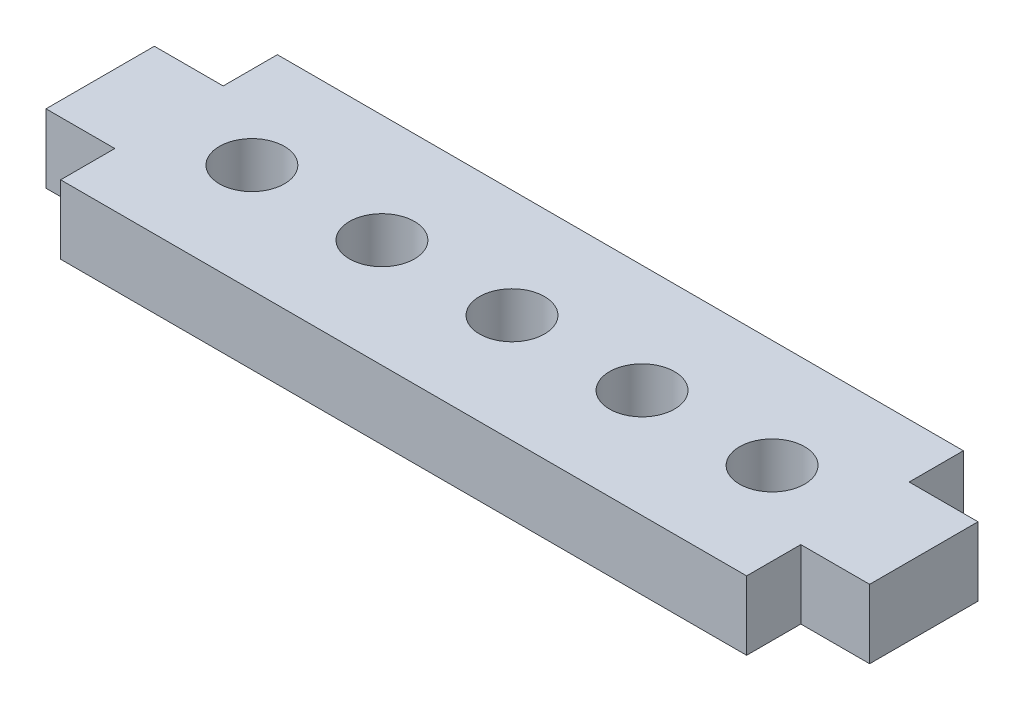
ISO-10303-21;
HEADER;
FILE_DESCRIPTION(('STEP AP214'),'2;1');
FILE_NAME('part.step','',(''),(''),'','','');
FILE_SCHEMA(('AUTOMOTIVE_DESIGN { 1 0 10303 214 1 1 1 1 }'));
ENDSEC;
DATA;
#1=APPLICATION_CONTEXT('core data for automotive mechanical design processes');
#2=APPLICATION_PROTOCOL_DEFINITION('international standard','automotive_design',2000,#1);
#3=PRODUCT_CONTEXT('',#1,'mechanical');
#4=PRODUCT('Part','Part','',(#3));
#5=PRODUCT_RELATED_PRODUCT_CATEGORY('part','',(#4));
#6=PRODUCT_DEFINITION_FORMATION('','',#4);
#7=PRODUCT_DEFINITION_CONTEXT('part definition',#1,'design');
#8=PRODUCT_DEFINITION('design','',#6,#7);
#9=PRODUCT_DEFINITION_SHAPE('','',#8);
#10=(LENGTH_UNIT() NAMED_UNIT(*) SI_UNIT(.MILLI.,.METRE.));
#11=(NAMED_UNIT(*) PLANE_ANGLE_UNIT() SI_UNIT($,.RADIAN.));
#12=(NAMED_UNIT(*) SI_UNIT($,.STERADIAN.) SOLID_ANGLE_UNIT());
#13=UNCERTAINTY_MEASURE_WITH_UNIT(LENGTH_MEASURE(1.E-05),#10,'distance_accuracy_value','');
#14=(GEOMETRIC_REPRESENTATION_CONTEXT(3) GLOBAL_UNCERTAINTY_ASSIGNED_CONTEXT((#13)) GLOBAL_UNIT_ASSIGNED_CONTEXT((#10,
#11,#12)) REPRESENTATION_CONTEXT('',''));
#15=CARTESIAN_POINT('',(0.,0.,0.));
#16=DIRECTION('',(0.,0.,1.));
#17=DIRECTION('',(1.,0.,0.));
#18=AXIS2_PLACEMENT_3D('',#15,#16,#17);
#19=CARTESIAN_POINT('',(0.,6.35,0.));
#20=DIRECTION('',(0.,-1.,0.));
#21=DIRECTION('',(0.,0.,-1.));
#22=AXIS2_PLACEMENT_3D('',#19,#20,#21);
#23=PLANE('',#22);
#24=DIRECTION('',(0.,0.,1.));
#25=VECTOR('',#24,1.);
#26=CARTESIAN_POINT('',(0.,6.35,0.));
#27=LINE('',#26,#25);
#28=CARTESIAN_POINT('',(0.,6.35,-5.00000000000002));
#29=VERTEX_POINT('',#28);
#30=CARTESIAN_POINT('',(0.,6.35,0.));
#31=VERTEX_POINT('',#30);
#32=EDGE_CURVE('E177',#29,#31,#27,.T.);
#33=ORIENTED_EDGE('',*,*,#32,.T.);
#34=DIRECTION('',(1.,0.,0.));
#35=VECTOR('',#34,1.);
#36=CARTESIAN_POINT('',(0.,6.35,0.));
#37=LINE('',#36,#35);
#38=CARTESIAN_POINT('',(63.3,6.35,0.));
#39=VERTEX_POINT('',#38);
#40=EDGE_CURVE('E105',#31,#39,#37,.T.);
#41=ORIENTED_EDGE('',*,*,#40,.T.);
#42=DIRECTION('',(0.,0.,-1.));
#43=VECTOR('',#42,1.);
#44=CARTESIAN_POINT('',(63.3,6.35,0.));
#45=LINE('',#44,#43);
#46=CARTESIAN_POINT('',(63.3,6.35,-5.00000000000001));
#47=VERTEX_POINT('',#46);
#48=EDGE_CURVE('E204',#39,#47,#45,.T.);
#49=ORIENTED_EDGE('',*,*,#48,.T.);
#50=DIRECTION('',(1.,0.,0.));
#51=VECTOR('',#50,1.);
#52=CARTESIAN_POINT('',(69.65,6.35,-5.00000000000002));
#53=LINE('',#52,#51);
#54=CARTESIAN_POINT('',(69.65,6.35,-5.00000000000002));
#55=VERTEX_POINT('',#54);
#56=EDGE_CURVE('E223',#47,#55,#53,.T.);
#57=ORIENTED_EDGE('',*,*,#56,.T.);
#58=DIRECTION('',(0.,0.,-1.));
#59=VECTOR('',#58,1.);
#60=CARTESIAN_POINT('',(69.65,6.35,-15.));
#61=LINE('',#60,#59);
#62=CARTESIAN_POINT('',(69.65,6.35,-15.));
#63=VERTEX_POINT('',#62);
#64=EDGE_CURVE('E220',#55,#63,#61,.T.);
#65=ORIENTED_EDGE('',*,*,#64,.T.);
#66=DIRECTION('',(-1.,0.,0.));
#67=VECTOR('',#66,1.);
#68=CARTESIAN_POINT('',(63.3,6.35,-15.));
#69=LINE('',#68,#67);
#70=CARTESIAN_POINT('',(63.3,6.35,-15.));
#71=VERTEX_POINT('',#70);
#72=EDGE_CURVE('E222',#63,#71,#69,.T.);
#73=ORIENTED_EDGE('',*,*,#72,.T.);
#74=DIRECTION('',(0.,0.,-1.));
#75=VECTOR('',#74,1.);
#76=CARTESIAN_POINT('',(63.3,6.35,-15.));
#77=LINE('',#76,#75);
#78=CARTESIAN_POINT('',(63.3,6.35,-20.));
#79=VERTEX_POINT('',#78);
#80=EDGE_CURVE('E225',#71,#79,#77,.T.);
#81=ORIENTED_EDGE('',*,*,#80,.T.);
#82=DIRECTION('',(-1.,0.,0.));
#83=VECTOR('',#82,1.);
#84=CARTESIAN_POINT('',(0.,6.35,-20.));
#85=LINE('',#84,#83);
#86=CARTESIAN_POINT('',(0.,6.35,-20.));
#87=VERTEX_POINT('',#86);
#88=EDGE_CURVE('E231',#79,#87,#85,.T.);
#89=ORIENTED_EDGE('',*,*,#88,.T.);
#90=DIRECTION('',(0.,0.,1.));
#91=VECTOR('',#90,1.);
#92=CARTESIAN_POINT('',(0.,6.35,-15.));
#93=LINE('',#92,#91);
#94=CARTESIAN_POINT('',(0.,6.35,-15.));
#95=VERTEX_POINT('',#94);
#96=EDGE_CURVE('E136',#87,#95,#93,.T.);
#97=ORIENTED_EDGE('',*,*,#96,.T.);
#98=DIRECTION('',(-1.,0.,0.));
#99=VECTOR('',#98,1.);
#100=CARTESIAN_POINT('',(0.,6.35,-15.));
#101=LINE('',#100,#99);
#102=CARTESIAN_POINT('',(-6.35,6.35,-15.));
#103=VERTEX_POINT('',#102);
#104=EDGE_CURVE('E130',#95,#103,#101,.T.);
#105=ORIENTED_EDGE('',*,*,#104,.T.);
#106=DIRECTION('',(0.,0.,1.));
#107=VECTOR('',#106,1.);
#108=CARTESIAN_POINT('',(-6.35,6.35,-15.));
#109=LINE('',#108,#107);
#110=CARTESIAN_POINT('',(-6.34999999999999,6.35,-5.00000000000002));
#111=VERTEX_POINT('',#110);
#112=EDGE_CURVE('E134',#103,#111,#109,.T.);
#113=ORIENTED_EDGE('',*,*,#112,.T.);
#114=DIRECTION('',(1.,0.,0.));
#115=VECTOR('',#114,1.);
#116=CARTESIAN_POINT('',(-6.34999999999999,6.35,-5.00000000000002));
#117=LINE('',#116,#115);
#118=EDGE_CURVE('E50',#111,#29,#117,.T.);
#119=ORIENTED_EDGE('',*,*,#118,.T.);
#120=EDGE_LOOP('',(#33,#41,#49,#57,#65,#73,#81,#89,#97,#105,#113,#119));
#121=FACE_BOUND('',#120,.T.);
#122=CARTESIAN_POINT('',(7.65000000000001,6.35,-10.));
#123=DIRECTION('',(0.,1.,0.));
#124=DIRECTION('',(0.,0.,1.));
#125=AXIS2_PLACEMENT_3D('',#122,#123,#124);
#126=CIRCLE('',#125,3.);
#127=CARTESIAN_POINT('',(7.65000000000001,6.35,-7.));
#128=VERTEX_POINT('',#127);
#129=EDGE_CURVE('E158',#128,#128,#126,.T.);
#130=ORIENTED_EDGE('',*,*,#129,.F.);
#131=EDGE_LOOP('',(#130));
#132=FACE_BOUND('',#131,.T.);
#133=CARTESIAN_POINT('',(19.65,6.35,-10.));
#134=DIRECTION('',(0.,1.,0.));
#135=DIRECTION('',(0.,0.,1.));
#136=AXIS2_PLACEMENT_3D('',#133,#134,#135);
#137=CIRCLE('',#136,3.);
#138=CARTESIAN_POINT('',(19.65,6.35,-7.));
#139=VERTEX_POINT('',#138);
#140=EDGE_CURVE('E305',#139,#139,#137,.T.);
#141=ORIENTED_EDGE('',*,*,#140,.F.);
#142=EDGE_LOOP('',(#141));
#143=FACE_BOUND('',#142,.T.);
#144=CARTESIAN_POINT('',(31.65,6.35,-10.));
#145=DIRECTION('',(0.,1.,0.));
#146=DIRECTION('',(0.,0.,1.));
#147=AXIS2_PLACEMENT_3D('',#144,#145,#146);
#148=CIRCLE('',#147,3.);
#149=CARTESIAN_POINT('',(31.65,6.35,-7.));
#150=VERTEX_POINT('',#149);
#151=EDGE_CURVE('E299',#150,#150,#148,.T.);
#152=ORIENTED_EDGE('',*,*,#151,.F.);
#153=EDGE_LOOP('',(#152));
#154=FACE_BOUND('',#153,.T.);
#155=CARTESIAN_POINT('',(43.65,6.35,-10.));
#156=DIRECTION('',(0.,1.,0.));
#157=DIRECTION('',(0.,0.,1.));
#158=AXIS2_PLACEMENT_3D('',#155,#156,#157);
#159=CIRCLE('',#158,3.);
#160=CARTESIAN_POINT('',(43.65,6.35,-7.));
#161=VERTEX_POINT('',#160);
#162=EDGE_CURVE('E293',#161,#161,#159,.T.);
#163=ORIENTED_EDGE('',*,*,#162,.F.);
#164=EDGE_LOOP('',(#163));
#165=FACE_BOUND('',#164,.T.);
#166=CARTESIAN_POINT('',(55.65,6.35,-10.));
#167=DIRECTION('',(0.,1.,0.));
#168=DIRECTION('',(0.,0.,1.));
#169=AXIS2_PLACEMENT_3D('',#166,#167,#168);
#170=CIRCLE('',#169,3.);
#171=CARTESIAN_POINT('',(55.65,6.35,-7.));
#172=VERTEX_POINT('',#171);
#173=EDGE_CURVE('E284',#172,#172,#170,.T.);
#174=ORIENTED_EDGE('',*,*,#173,.F.);
#175=EDGE_LOOP('',(#174));
#176=FACE_BOUND('',#175,.T.);
#177=ADVANCED_FACE('F33',(#121,#132,#143,#154,#165,#176),#23,.F.);
#178=CARTESIAN_POINT('',(0.,0.,0.));
#179=DIRECTION('',(0.,-1.,0.));
#180=DIRECTION('',(0.,0.,-1.));
#181=AXIS2_PLACEMENT_3D('',#178,#179,#180);
#182=PLANE('',#181);
#183=CARTESIAN_POINT('',(43.65,0.,-10.));
#184=DIRECTION('',(0.,1.,0.));
#185=DIRECTION('',(0.,0.,1.));
#186=AXIS2_PLACEMENT_3D('',#183,#184,#185);
#187=CIRCLE('',#186,3.);
#188=CARTESIAN_POINT('',(43.65,0.,-7.));
#189=VERTEX_POINT('',#188);
#190=EDGE_CURVE('E290',#189,#189,#187,.T.);
#191=ORIENTED_EDGE('',*,*,#190,.T.);
#192=EDGE_LOOP('',(#191));
#193=FACE_BOUND('',#192,.T.);
#194=CARTESIAN_POINT('',(19.65,0.,-10.));
#195=DIRECTION('',(0.,1.,0.));
#196=DIRECTION('',(0.,0.,1.));
#197=AXIS2_PLACEMENT_3D('',#194,#195,#196);
#198=CIRCLE('',#197,3.);
#199=CARTESIAN_POINT('',(19.65,0.,-7.));
#200=VERTEX_POINT('',#199);
#201=EDGE_CURVE('E302',#200,#200,#198,.T.);
#202=ORIENTED_EDGE('',*,*,#201,.T.);
#203=EDGE_LOOP('',(#202));
#204=FACE_BOUND('',#203,.T.);
#205=DIRECTION('',(0.,0.,1.));
#206=VECTOR('',#205,1.);
#207=CARTESIAN_POINT('',(0.,0.,0.));
#208=LINE('',#207,#206);
#209=CARTESIAN_POINT('',(0.,0.,-5.00000000000002));
#210=VERTEX_POINT('',#209);
#211=CARTESIAN_POINT('',(0.,0.,0.));
#212=VERTEX_POINT('',#211);
#213=EDGE_CURVE('E154',#210,#212,#208,.T.);
#214=ORIENTED_EDGE('',*,*,#213,.F.);
#215=DIRECTION('',(1.,0.,0.));
#216=VECTOR('',#215,1.);
#217=CARTESIAN_POINT('',(-6.34999999999999,0.,-5.00000000000002));
#218=LINE('',#217,#216);
#219=CARTESIAN_POINT('',(-6.34999999999999,0.,-5.00000000000002));
#220=VERTEX_POINT('',#219);
#221=EDGE_CURVE('E97',#220,#210,#218,.T.);
#222=ORIENTED_EDGE('',*,*,#221,.F.);
#223=DIRECTION('',(0.,0.,1.));
#224=VECTOR('',#223,1.);
#225=CARTESIAN_POINT('',(-6.35,0.,-15.));
#226=LINE('',#225,#224);
#227=CARTESIAN_POINT('',(-6.35,0.,-15.));
#228=VERTEX_POINT('',#227);
#229=EDGE_CURVE('E91',#228,#220,#226,.T.);
#230=ORIENTED_EDGE('',*,*,#229,.F.);
#231=DIRECTION('',(-1.,0.,0.));
#232=VECTOR('',#231,1.);
#233=CARTESIAN_POINT('',(0.,0.,-15.));
#234=LINE('',#233,#232);
#235=CARTESIAN_POINT('',(0.,0.,-15.));
#236=VERTEX_POINT('',#235);
#237=EDGE_CURVE('E144',#236,#228,#234,.T.);
#238=ORIENTED_EDGE('',*,*,#237,.F.);
#239=DIRECTION('',(0.,0.,1.));
#240=VECTOR('',#239,1.);
#241=CARTESIAN_POINT('',(0.,0.,-15.));
#242=LINE('',#241,#240);
#243=CARTESIAN_POINT('',(0.,0.,-20.));
#244=VERTEX_POINT('',#243);
#245=EDGE_CURVE('E172',#244,#236,#242,.T.);
#246=ORIENTED_EDGE('',*,*,#245,.F.);
#247=DIRECTION('',(-1.,0.,0.));
#248=VECTOR('',#247,1.);
#249=CARTESIAN_POINT('',(0.,0.,-20.));
#250=LINE('',#249,#248);
#251=CARTESIAN_POINT('',(63.3,0.,-20.));
#252=VERTEX_POINT('',#251);
#253=EDGE_CURVE('E170',#252,#244,#250,.T.);
#254=ORIENTED_EDGE('',*,*,#253,.F.);
#255=DIRECTION('',(0.,0.,-1.));
#256=VECTOR('',#255,1.);
#257=CARTESIAN_POINT('',(63.3,0.,-15.));
#258=LINE('',#257,#256);
#259=CARTESIAN_POINT('',(63.3,0.,-15.));
#260=VERTEX_POINT('',#259);
#261=EDGE_CURVE('E168',#260,#252,#258,.T.);
#262=ORIENTED_EDGE('',*,*,#261,.F.);
#263=DIRECTION('',(-1.,0.,0.));
#264=VECTOR('',#263,1.);
#265=CARTESIAN_POINT('',(63.3,0.,-15.));
#266=LINE('',#265,#264);
#267=CARTESIAN_POINT('',(69.65,0.,-15.));
#268=VERTEX_POINT('',#267);
#269=EDGE_CURVE('E166',#268,#260,#266,.T.);
#270=ORIENTED_EDGE('',*,*,#269,.F.);
#271=DIRECTION('',(0.,0.,-1.));
#272=VECTOR('',#271,1.);
#273=CARTESIAN_POINT('',(69.65,0.,-15.));
#274=LINE('',#273,#272);
#275=CARTESIAN_POINT('',(69.65,0.,-5.00000000000002));
#276=VERTEX_POINT('',#275);
#277=EDGE_CURVE('E164',#276,#268,#274,.T.);
#278=ORIENTED_EDGE('',*,*,#277,.F.);
#279=DIRECTION('',(1.,0.,0.));
#280=VECTOR('',#279,1.);
#281=CARTESIAN_POINT('',(69.65,0.,-5.00000000000002));
#282=LINE('',#281,#280);
#283=CARTESIAN_POINT('',(63.3,0.,-5.00000000000001));
#284=VERTEX_POINT('',#283);
#285=EDGE_CURVE('E162',#284,#276,#282,.T.);
#286=ORIENTED_EDGE('',*,*,#285,.F.);
#287=DIRECTION('',(0.,0.,-1.));
#288=VECTOR('',#287,1.);
#289=CARTESIAN_POINT('',(63.3,0.,0.));
#290=LINE('',#289,#288);
#291=CARTESIAN_POINT('',(63.3,0.,0.));
#292=VERTEX_POINT('',#291);
#293=EDGE_CURVE('E160',#292,#284,#290,.T.);
#294=ORIENTED_EDGE('',*,*,#293,.F.);
#295=DIRECTION('',(1.,0.,0.));
#296=VECTOR('',#295,1.);
#297=CARTESIAN_POINT('',(0.,0.,0.));
#298=LINE('',#297,#296);
#299=EDGE_CURVE('E157',#212,#292,#298,.T.);
#300=ORIENTED_EDGE('',*,*,#299,.F.);
#301=EDGE_LOOP('',(#214,#222,#230,#238,#246,#254,#262,#270,#278,#286,#294,#300));
#302=FACE_BOUND('',#301,.T.);
#303=CARTESIAN_POINT('',(7.65000000000001,0.,-10.));
#304=DIRECTION('',(0.,1.,0.));
#305=DIRECTION('',(0.,0.,1.));
#306=AXIS2_PLACEMENT_3D('',#303,#304,#305);
#307=CIRCLE('',#306,3.);
#308=CARTESIAN_POINT('',(7.65000000000001,0.,-7.));
#309=VERTEX_POINT('',#308);
#310=EDGE_CURVE('E308',#309,#309,#307,.T.);
#311=ORIENTED_EDGE('',*,*,#310,.T.);
#312=EDGE_LOOP('',(#311));
#313=FACE_BOUND('',#312,.T.);
#314=CARTESIAN_POINT('',(31.65,0.,-10.));
#315=DIRECTION('',(0.,1.,0.));
#316=DIRECTION('',(0.,0.,1.));
#317=AXIS2_PLACEMENT_3D('',#314,#315,#316);
#318=CIRCLE('',#317,3.);
#319=CARTESIAN_POINT('',(31.65,0.,-7.));
#320=VERTEX_POINT('',#319);
#321=EDGE_CURVE('E296',#320,#320,#318,.T.);
#322=ORIENTED_EDGE('',*,*,#321,.T.);
#323=EDGE_LOOP('',(#322));
#324=FACE_BOUND('',#323,.T.);
#325=CARTESIAN_POINT('',(55.65,0.,-10.));
#326=DIRECTION('',(0.,1.,0.));
#327=DIRECTION('',(0.,0.,1.));
#328=AXIS2_PLACEMENT_3D('',#325,#326,#327);
#329=CIRCLE('',#328,3.);
#330=CARTESIAN_POINT('',(55.65,0.,-7.));
#331=VERTEX_POINT('',#330);
#332=EDGE_CURVE('E287',#331,#331,#329,.T.);
#333=ORIENTED_EDGE('',*,*,#332,.T.);
#334=EDGE_LOOP('',(#333));
#335=FACE_BOUND('',#334,.T.);
#336=ADVANCED_FACE('F208',(#193,#204,#302,#313,#324,#335),#182,.T.);
#337=CARTESIAN_POINT('',(0.,6.35,0.));
#338=DIRECTION('',(1.,0.,0.));
#339=DIRECTION('',(0.,0.,-1.));
#340=AXIS2_PLACEMENT_3D('',#337,#338,#339);
#341=PLANE('',#340);
#342=ORIENTED_EDGE('',*,*,#213,.T.);
#343=DIRECTION('',(0.,-1.,0.));
#344=VECTOR('',#343,1.);
#345=CARTESIAN_POINT('',(0.,6.35,0.));
#346=LINE('',#345,#344);
#347=EDGE_CURVE('E11',#31,#212,#346,.T.);
#348=ORIENTED_EDGE('',*,*,#347,.F.);
#349=ORIENTED_EDGE('',*,*,#32,.F.);
#350=DIRECTION('',(0.,-1.,0.));
#351=VECTOR('',#350,1.);
#352=CARTESIAN_POINT('',(0.,6.35,-5.00000000000002));
#353=LINE('',#352,#351);
#354=EDGE_CURVE('E150',#29,#210,#353,.T.);
#355=ORIENTED_EDGE('',*,*,#354,.T.);
#356=EDGE_LOOP('',(#342,#348,#349,#355));
#357=FACE_BOUND('',#356,.T.);
#358=ADVANCED_FACE('F35',(#357),#341,.F.);
#359=CARTESIAN_POINT('',(0.,6.35,0.));
#360=DIRECTION('',(0.,0.,-1.));
#361=DIRECTION('',(-1.,0.,0.));
#362=AXIS2_PLACEMENT_3D('',#359,#360,#361);
#363=PLANE('',#362);
#364=ORIENTED_EDGE('',*,*,#299,.T.);
#365=DIRECTION('',(0.,-1.,0.));
#366=VECTOR('',#365,1.);
#367=CARTESIAN_POINT('',(63.3,6.35,0.));
#368=LINE('',#367,#366);
#369=EDGE_CURVE('E42',#39,#292,#368,.T.);
#370=ORIENTED_EDGE('',*,*,#369,.F.);
#371=ORIENTED_EDGE('',*,*,#40,.F.);
#372=ORIENTED_EDGE('',*,*,#347,.T.);
#373=EDGE_LOOP('',(#364,#370,#371,#372));
#374=FACE_BOUND('',#373,.T.);
#375=ADVANCED_FACE('F429',(#374),#363,.F.);
#376=CARTESIAN_POINT('',(63.3,6.35,0.));
#377=DIRECTION('',(-1.,0.,0.));
#378=DIRECTION('',(0.,0.,1.));
#379=AXIS2_PLACEMENT_3D('',#376,#377,#378);
#380=PLANE('',#379);
#381=ORIENTED_EDGE('',*,*,#293,.T.);
#382=DIRECTION('',(0.,-1.,0.));
#383=VECTOR('',#382,1.);
#384=CARTESIAN_POINT('',(63.3,6.35,-5.00000000000001));
#385=LINE('',#384,#383);
#386=EDGE_CURVE('E196',#47,#284,#385,.T.);
#387=ORIENTED_EDGE('',*,*,#386,.F.);
#388=ORIENTED_EDGE('',*,*,#48,.F.);
#389=ORIENTED_EDGE('',*,*,#369,.T.);
#390=EDGE_LOOP('',(#381,#387,#388,#389));
#391=FACE_BOUND('',#390,.T.);
#392=ADVANCED_FACE('F202',(#391),#380,.F.);
#393=CARTESIAN_POINT('',(69.65,6.35,-5.00000000000002));
#394=DIRECTION('',(0.,0.,-1.));
#395=DIRECTION('',(-1.,0.,0.));
#396=AXIS2_PLACEMENT_3D('',#393,#394,#395);
#397=PLANE('',#396);
#398=ORIENTED_EDGE('',*,*,#285,.T.);
#399=DIRECTION('',(0.,-1.,0.));
#400=VECTOR('',#399,1.);
#401=CARTESIAN_POINT('',(69.65,6.35,-5.00000000000002));
#402=LINE('',#401,#400);
#403=EDGE_CURVE('E193',#55,#276,#402,.T.);
#404=ORIENTED_EDGE('',*,*,#403,.F.);
#405=ORIENTED_EDGE('',*,*,#56,.F.);
#406=ORIENTED_EDGE('',*,*,#386,.T.);
#407=EDGE_LOOP('',(#398,#404,#405,#406));
#408=FACE_BOUND('',#407,.T.);
#409=ADVANCED_FACE('F214',(#408),#397,.F.);
#410=CARTESIAN_POINT('',(69.65,6.35,-15.));
#411=DIRECTION('',(-1.,0.,0.));
#412=DIRECTION('',(0.,0.,1.));
#413=AXIS2_PLACEMENT_3D('',#410,#411,#412);
#414=PLANE('',#413);
#415=ORIENTED_EDGE('',*,*,#277,.T.);
#416=DIRECTION('',(0.,-1.,0.));
#417=VECTOR('',#416,1.);
#418=CARTESIAN_POINT('',(69.65,6.35,-15.));
#419=LINE('',#418,#417);
#420=EDGE_CURVE('E190',#63,#268,#419,.T.);
#421=ORIENTED_EDGE('',*,*,#420,.F.);
#422=ORIENTED_EDGE('',*,*,#64,.F.);
#423=ORIENTED_EDGE('',*,*,#403,.T.);
#424=EDGE_LOOP('',(#415,#421,#422,#423));
#425=FACE_BOUND('',#424,.T.);
#426=ADVANCED_FACE('F218',(#425),#414,.F.);
#427=CARTESIAN_POINT('',(63.3,6.35,-15.));
#428=DIRECTION('',(0.,0.,1.));
#429=DIRECTION('',(1.,0.,0.));
#430=AXIS2_PLACEMENT_3D('',#427,#428,#429);
#431=PLANE('',#430);
#432=ORIENTED_EDGE('',*,*,#269,.T.);
#433=DIRECTION('',(0.,-1.,0.));
#434=VECTOR('',#433,1.);
#435=CARTESIAN_POINT('',(63.3,6.35,-15.));
#436=LINE('',#435,#434);
#437=EDGE_CURVE('E187',#71,#260,#436,.T.);
#438=ORIENTED_EDGE('',*,*,#437,.F.);
#439=ORIENTED_EDGE('',*,*,#72,.F.);
#440=ORIENTED_EDGE('',*,*,#420,.T.);
#441=EDGE_LOOP('',(#432,#438,#439,#440));
#442=FACE_BOUND('',#441,.T.);
#443=ADVANCED_FACE('F394',(#442),#431,.F.);
#444=CARTESIAN_POINT('',(63.3,6.35,-15.));
#445=DIRECTION('',(-1.,0.,0.));
#446=DIRECTION('',(0.,0.,1.));
#447=AXIS2_PLACEMENT_3D('',#444,#445,#446);
#448=PLANE('',#447);
#449=ORIENTED_EDGE('',*,*,#261,.T.);
#450=DIRECTION('',(0.,-1.,0.));
#451=VECTOR('',#450,1.);
#452=CARTESIAN_POINT('',(63.3,6.35,-20.));
#453=LINE('',#452,#451);
#454=EDGE_CURVE('E184',#79,#252,#453,.T.);
#455=ORIENTED_EDGE('',*,*,#454,.F.);
#456=ORIENTED_EDGE('',*,*,#80,.F.);
#457=ORIENTED_EDGE('',*,*,#437,.T.);
#458=EDGE_LOOP('',(#449,#455,#456,#457));
#459=FACE_BOUND('',#458,.T.);
#460=ADVANCED_FACE('F385',(#459),#448,.F.);
#461=CARTESIAN_POINT('',(0.,6.35,-20.));
#462=DIRECTION('',(0.,0.,1.));
#463=DIRECTION('',(1.,0.,0.));
#464=AXIS2_PLACEMENT_3D('',#461,#462,#463);
#465=PLANE('',#464);
#466=ORIENTED_EDGE('',*,*,#253,.T.);
#467=DIRECTION('',(0.,-1.,0.));
#468=VECTOR('',#467,1.);
#469=CARTESIAN_POINT('',(0.,6.35,-20.));
#470=LINE('',#469,#468);
#471=EDGE_CURVE('E181',#87,#244,#470,.T.);
#472=ORIENTED_EDGE('',*,*,#471,.F.);
#473=ORIENTED_EDGE('',*,*,#88,.F.);
#474=ORIENTED_EDGE('',*,*,#454,.T.);
#475=EDGE_LOOP('',(#466,#472,#473,#474));
#476=FACE_BOUND('',#475,.T.);
#477=ADVANCED_FACE('F237',(#476),#465,.F.);
#478=CARTESIAN_POINT('',(0.,6.35,-15.));
#479=DIRECTION('',(1.,0.,0.));
#480=DIRECTION('',(0.,0.,-1.));
#481=AXIS2_PLACEMENT_3D('',#478,#479,#480);
#482=PLANE('',#481);
#483=ORIENTED_EDGE('',*,*,#245,.T.);
#484=DIRECTION('',(0.,-1.,0.));
#485=VECTOR('',#484,1.);
#486=CARTESIAN_POINT('',(0.,6.35,-15.));
#487=LINE('',#486,#485);
#488=EDGE_CURVE('E145',#95,#236,#487,.T.);
#489=ORIENTED_EDGE('',*,*,#488,.F.);
#490=ORIENTED_EDGE('',*,*,#96,.F.);
#491=ORIENTED_EDGE('',*,*,#471,.T.);
#492=EDGE_LOOP('',(#483,#489,#490,#491));
#493=FACE_BOUND('',#492,.T.);
#494=ADVANCED_FACE('F241',(#493),#482,.F.);
#495=CARTESIAN_POINT('',(0.,6.35,-15.));
#496=DIRECTION('',(0.,0.,1.));
#497=DIRECTION('',(1.,0.,0.));
#498=AXIS2_PLACEMENT_3D('',#495,#496,#497);
#499=PLANE('',#498);
#500=ORIENTED_EDGE('',*,*,#237,.T.);
#501=DIRECTION('',(0.,-1.,0.));
#502=VECTOR('',#501,1.);
#503=CARTESIAN_POINT('',(-6.35,6.35,-15.));
#504=LINE('',#503,#502);
#505=EDGE_CURVE('E141',#103,#228,#504,.T.);
#506=ORIENTED_EDGE('',*,*,#505,.F.);
#507=ORIENTED_EDGE('',*,*,#104,.F.);
#508=ORIENTED_EDGE('',*,*,#488,.T.);
#509=EDGE_LOOP('',(#500,#506,#507,#508));
#510=FACE_BOUND('',#509,.T.);
#511=ADVANCED_FACE('F142',(#510),#499,.F.);
#512=CARTESIAN_POINT('',(-6.35,6.35,-15.));
#513=DIRECTION('',(1.,0.,0.));
#514=DIRECTION('',(0.,0.,-1.));
#515=AXIS2_PLACEMENT_3D('',#512,#513,#514);
#516=PLANE('',#515);
#517=ORIENTED_EDGE('',*,*,#229,.T.);
#518=DIRECTION('',(0.,-1.,0.));
#519=VECTOR('',#518,1.);
#520=CARTESIAN_POINT('',(-6.34999999999999,6.35,-5.00000000000002));
#521=LINE('',#520,#519);
#522=EDGE_CURVE('E146',#111,#220,#521,.T.);
#523=ORIENTED_EDGE('',*,*,#522,.F.);
#524=ORIENTED_EDGE('',*,*,#112,.F.);
#525=ORIENTED_EDGE('',*,*,#505,.T.);
#526=EDGE_LOOP('',(#517,#523,#524,#525));
#527=FACE_BOUND('',#526,.T.);
#528=ADVANCED_FACE('F148',(#527),#516,.F.);
#529=CARTESIAN_POINT('',(-6.34999999999999,6.35,-5.00000000000002));
#530=DIRECTION('',(0.,0.,-1.));
#531=DIRECTION('',(-1.,0.,0.));
#532=AXIS2_PLACEMENT_3D('',#529,#530,#531);
#533=PLANE('',#532);
#534=ORIENTED_EDGE('',*,*,#221,.T.);
#535=ORIENTED_EDGE('',*,*,#354,.F.);
#536=ORIENTED_EDGE('',*,*,#118,.F.);
#537=ORIENTED_EDGE('',*,*,#522,.T.);
#538=EDGE_LOOP('',(#534,#535,#536,#537));
#539=FACE_BOUND('',#538,.T.);
#540=ADVANCED_FACE('F245',(#539),#533,.F.);
#541=CARTESIAN_POINT('',(7.65000000000001,6.35,-10.));
#542=DIRECTION('',(0.,-1.,0.));
#543=DIRECTION('',(0.,0.,-1.));
#544=AXIS2_PLACEMENT_3D('',#541,#542,#543);
#545=CYLINDRICAL_SURFACE('',#544,3.);
#546=ORIENTED_EDGE('',*,*,#129,.T.);
#547=EDGE_LOOP('',(#546));
#548=FACE_BOUND('',#547,.T.);
#549=ORIENTED_EDGE('',*,*,#310,.F.);
#550=EDGE_LOOP('',(#549));
#551=FACE_BOUND('',#550,.T.);
#552=ADVANCED_FACE('F247',(#548,#551),#545,.F.);
#553=CARTESIAN_POINT('',(19.65,6.35,-10.));
#554=DIRECTION('',(0.,-1.,0.));
#555=DIRECTION('',(0.,0.,-1.));
#556=AXIS2_PLACEMENT_3D('',#553,#554,#555);
#557=CYLINDRICAL_SURFACE('',#556,3.);
#558=ORIENTED_EDGE('',*,*,#140,.T.);
#559=EDGE_LOOP('',(#558));
#560=FACE_BOUND('',#559,.T.);
#561=ORIENTED_EDGE('',*,*,#201,.F.);
#562=EDGE_LOOP('',(#561));
#563=FACE_BOUND('',#562,.T.);
#564=ADVANCED_FACE('F253',(#560,#563),#557,.F.);
#565=CARTESIAN_POINT('',(31.65,6.35,-10.));
#566=DIRECTION('',(0.,-1.,0.));
#567=DIRECTION('',(0.,0.,-1.));
#568=AXIS2_PLACEMENT_3D('',#565,#566,#567);
#569=CYLINDRICAL_SURFACE('',#568,3.);
#570=ORIENTED_EDGE('',*,*,#151,.T.);
#571=EDGE_LOOP('',(#570));
#572=FACE_BOUND('',#571,.T.);
#573=ORIENTED_EDGE('',*,*,#321,.F.);
#574=EDGE_LOOP('',(#573));
#575=FACE_BOUND('',#574,.T.);
#576=ADVANCED_FACE('F267',(#572,#575),#569,.F.);
#577=CARTESIAN_POINT('',(43.65,6.35,-10.));
#578=DIRECTION('',(0.,-1.,0.));
#579=DIRECTION('',(0.,0.,-1.));
#580=AXIS2_PLACEMENT_3D('',#577,#578,#579);
#581=CYLINDRICAL_SURFACE('',#580,3.);
#582=ORIENTED_EDGE('',*,*,#162,.T.);
#583=EDGE_LOOP('',(#582));
#584=FACE_BOUND('',#583,.T.);
#585=ORIENTED_EDGE('',*,*,#190,.F.);
#586=EDGE_LOOP('',(#585));
#587=FACE_BOUND('',#586,.T.);
#588=ADVANCED_FACE('F271',(#584,#587),#581,.F.);
#589=CARTESIAN_POINT('',(55.65,6.35,-10.));
#590=DIRECTION('',(0.,-1.,0.));
#591=DIRECTION('',(0.,0.,-1.));
#592=AXIS2_PLACEMENT_3D('',#589,#590,#591);
#593=CYLINDRICAL_SURFACE('',#592,3.);
#594=ORIENTED_EDGE('',*,*,#173,.T.);
#595=EDGE_LOOP('',(#594));
#596=FACE_BOUND('',#595,.T.);
#597=ORIENTED_EDGE('',*,*,#332,.F.);
#598=EDGE_LOOP('',(#597));
#599=FACE_BOUND('',#598,.T.);
#600=ADVANCED_FACE('F275',(#596,#599),#593,.F.);
#601=CLOSED_SHELL('',(#177,#336,#358,#375,#392,#409,#426,#443,#460,#477,#494,#511,#528,#540,
#552,#564,#576,#588,#600));
#602=MANIFOLD_SOLID_BREP('B2',#601);
#603=ADVANCED_BREP_SHAPE_REPRESENTATION('',(#18,#602),#14);
#604=SHAPE_DEFINITION_REPRESENTATION(#9,#603);
ENDSEC;
END-ISO-10303-21;
